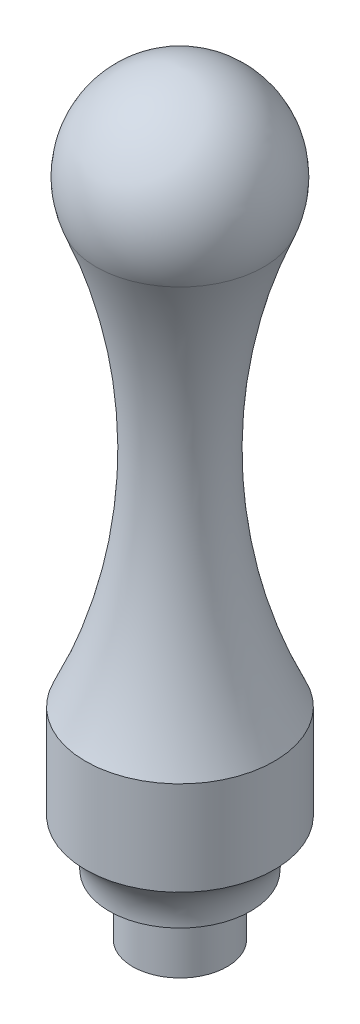
ISO-10303-21;
HEADER;
FILE_DESCRIPTION(('STEP AP214'),'2;1');
FILE_NAME('part.step','',(''),(''),'','','');
FILE_SCHEMA(('AUTOMOTIVE_DESIGN { 1 0 10303 214 1 1 1 1 }'));
ENDSEC;
DATA;
#1=APPLICATION_CONTEXT('core data for automotive mechanical design processes');
#2=APPLICATION_PROTOCOL_DEFINITION('international standard','automotive_design',2000,#1);
#3=PRODUCT_CONTEXT('',#1,'mechanical');
#4=PRODUCT('Part','Part','',(#3));
#5=PRODUCT_RELATED_PRODUCT_CATEGORY('part','',(#4));
#6=PRODUCT_DEFINITION_FORMATION('','',#4);
#7=PRODUCT_DEFINITION_CONTEXT('part definition',#1,'design');
#8=PRODUCT_DEFINITION('design','',#6,#7);
#9=PRODUCT_DEFINITION_SHAPE('','',#8);
#10=(LENGTH_UNIT() NAMED_UNIT(*) SI_UNIT(.MILLI.,.METRE.));
#11=(NAMED_UNIT(*) PLANE_ANGLE_UNIT() SI_UNIT($,.RADIAN.));
#12=(NAMED_UNIT(*) SI_UNIT($,.STERADIAN.) SOLID_ANGLE_UNIT());
#13=UNCERTAINTY_MEASURE_WITH_UNIT(LENGTH_MEASURE(1.E-05),#10,'distance_accuracy_value','');
#14=(GEOMETRIC_REPRESENTATION_CONTEXT(3) GLOBAL_UNCERTAINTY_ASSIGNED_CONTEXT((#13)) GLOBAL_UNIT_ASSIGNED_CONTEXT((#10,
#11,#12)) REPRESENTATION_CONTEXT('',''));
#15=CARTESIAN_POINT('',(0.,0.,0.));
#16=DIRECTION('',(0.,0.,1.));
#17=DIRECTION('',(1.,0.,0.));
#18=AXIS2_PLACEMENT_3D('',#15,#16,#17);
#19=CARTESIAN_POINT('',(0.,70.0058490134191,-0.341973767158095));
#20=DIRECTION('',(-1.,0.,0.));
#21=DIRECTION('',(0.,0.,1.));
#22=AXIS2_PLACEMENT_3D('',#19,#20,#21);
#23=CIRCLE('',#22,9.99999999999999);
#24=TRIMMED_CURVE('',#23,(PARAMETER_VALUE(-1.53659228115495)),
(PARAMETER_VALUE(1.53659228115495)),.T.,.PARAMETER.);
#25=CARTESIAN_POINT('',(0.,70.0058490134191,0.));
#26=DIRECTION('',(0.,1.,0.));
#27=AXIS1_PLACEMENT('',#25,#26);
#28=SURFACE_OF_REVOLUTION('',#24,#27);
#29=CARTESIAN_POINT('',(0.,66.1587953190469,0.));
#30=DIRECTION('',(0.,1.,0.));
#31=DIRECTION('',(0.,0.,1.));
#32=AXIS2_PLACEMENT_3D('',#29,#30,#31);
#33=CIRCLE('',#32,8.88842047537658);
#34=CARTESIAN_POINT('',(0.,66.1587953190469,8.88842047537658));
#35=VERTEX_POINT('',#34);
#36=EDGE_CURVE('E11',#35,#35,#33,.T.);
#37=ORIENTED_EDGE('',*,*,#36,.T.);
#38=EDGE_LOOP('',(#37));
#39=FACE_BOUND('',#38,.T.);
#40=CARTESIAN_POINT('',(0.,80.,0.));
#41=VERTEX_POINT('',#40);
#42=VERTEX_LOOP('',#41);
#43=FACE_BOUND('',#42,.T.);
#44=ADVANCED_FACE('F34',(#39,#43),#28,.T.);
#45=CARTESIAN_POINT('',(0.,45.,0.));
#46=DIRECTION('',(0.,1.,0.));
#47=DIRECTION('',(0.,0.,1.));
#48=AXIS2_PLACEMENT_3D('',#45,#46,#47);
#49=TOROIDAL_SURFACE('',#48,59.6555888093173,55.);
#50=ORIENTED_EDGE('',*,*,#36,.F.);
#51=EDGE_LOOP('',(#50));
#52=FACE_BOUND('',#51,.T.);
#53=CARTESIAN_POINT('',(0.,21.35,0.));
#54=DIRECTION('',(0.,1.,0.));
#55=DIRECTION('',(0.,0.,1.));
#56=AXIS2_PLACEMENT_3D('',#53,#54,#55);
#57=CIRCLE('',#56,10.);
#58=CARTESIAN_POINT('',(0.,21.35,10.));
#59=VERTEX_POINT('',#58);
#60=EDGE_CURVE('E40',#59,#59,#57,.T.);
#61=ORIENTED_EDGE('',*,*,#60,.T.);
#62=EDGE_LOOP('',(#61));
#63=FACE_BOUND('',#62,.T.);
#64=ADVANCED_FACE('F44',(#52,#63),#49,.F.);
#65=CARTESIAN_POINT('',(0.,0.,0.));
#66=DIRECTION('',(0.,1.,0.));
#67=DIRECTION('',(0.,0.,1.));
#68=AXIS2_PLACEMENT_3D('',#65,#66,#67);
#69=CYLINDRICAL_SURFACE('',#68,10.);
#70=ORIENTED_EDGE('',*,*,#60,.F.);
#71=EDGE_LOOP('',(#70));
#72=FACE_BOUND('',#71,.T.);
#73=CARTESIAN_POINT('',(0.,11.399752469181,0.));
#74=DIRECTION('',(0.,1.,0.));
#75=DIRECTION('',(0.,0.,1.));
#76=AXIS2_PLACEMENT_3D('',#73,#74,#75);
#77=CIRCLE('',#76,10.);
#78=CARTESIAN_POINT('',(0.,11.399752469181,10.));
#79=VERTEX_POINT('',#78);
#80=EDGE_CURVE('E56',#79,#79,#77,.T.);
#81=ORIENTED_EDGE('',*,*,#80,.T.);
#82=EDGE_LOOP('',(#81));
#83=FACE_BOUND('',#82,.T.);
#84=ADVANCED_FACE('F49',(#72,#83),#69,.T.);
#85=CARTESIAN_POINT('',(0.,6.35,0.));
#86=DIRECTION('',(0.,1.,0.));
#87=DIRECTION('',(0.,0.,1.));
#88=AXIS2_PLACEMENT_3D('',#85,#86,#87);
#89=TOROIDAL_SURFACE('',#88,13.85,6.35);
#90=ORIENTED_EDGE('',*,*,#80,.F.);
#91=EDGE_LOOP('',(#90));
#92=FACE_BOUND('',#91,.T.);
#93=CARTESIAN_POINT('',(0.,6.34999999999999,0.));
#94=DIRECTION('',(0.,1.,0.));
#95=DIRECTION('',(0.,0.,1.));
#96=AXIS2_PLACEMENT_3D('',#93,#94,#95);
#97=CIRCLE('',#96,7.50000000000001);
#98=CARTESIAN_POINT('',(0.,6.34999999999999,7.50000000000001));
#99=VERTEX_POINT('',#98);
#100=EDGE_CURVE('E58',#99,#99,#97,.T.);
#101=ORIENTED_EDGE('',*,*,#100,.T.);
#102=EDGE_LOOP('',(#101));
#103=FACE_BOUND('',#102,.T.);
#104=ADVANCED_FACE('F84',(#92,#103),#89,.F.);
#105=CARTESIAN_POINT('',(5.,6.35,0.));
#106=DIRECTION('',(0.,1.,0.));
#107=DIRECTION('',(0.,0.,1.));
#108=AXIS2_PLACEMENT_3D('',#105,#106,#107);
#109=PLANE('',#108);
#110=ORIENTED_EDGE('',*,*,#100,.F.);
#111=EDGE_LOOP('',(#110));
#112=FACE_BOUND('',#111,.T.);
#113=CARTESIAN_POINT('',(0.,6.35,0.));
#114=DIRECTION('',(0.,1.,0.));
#115=DIRECTION('',(0.,0.,1.));
#116=AXIS2_PLACEMENT_3D('',#113,#114,#115);
#117=CIRCLE('',#116,5.);
#118=CARTESIAN_POINT('',(0.,6.35,5.));
#119=VERTEX_POINT('',#118);
#120=EDGE_CURVE('E63',#119,#119,#117,.T.);
#121=ORIENTED_EDGE('',*,*,#120,.T.);
#122=EDGE_LOOP('',(#121));
#123=FACE_BOUND('',#122,.T.);
#124=ADVANCED_FACE('F78',(#112,#123),#109,.F.);
#125=CARTESIAN_POINT('',(0.,0.,0.));
#126=DIRECTION('',(0.,1.,0.));
#127=DIRECTION('',(0.,0.,1.));
#128=AXIS2_PLACEMENT_3D('',#125,#126,#127);
#129=CYLINDRICAL_SURFACE('',#128,5.);
#130=ORIENTED_EDGE('',*,*,#120,.F.);
#131=EDGE_LOOP('',(#130));
#132=FACE_BOUND('',#131,.T.);
#133=CARTESIAN_POINT('',(0.,0.,0.));
#134=DIRECTION('',(0.,1.,0.));
#135=DIRECTION('',(0.,0.,1.));
#136=AXIS2_PLACEMENT_3D('',#133,#134,#135);
#137=CIRCLE('',#136,5.);
#138=CARTESIAN_POINT('',(0.,0.,5.));
#139=VERTEX_POINT('',#138);
#140=EDGE_CURVE('E66',#139,#139,#137,.T.);
#141=ORIENTED_EDGE('',*,*,#140,.T.);
#142=EDGE_LOOP('',(#141));
#143=FACE_BOUND('',#142,.T.);
#144=ADVANCED_FACE('F70',(#132,#143),#129,.T.);
#145=CARTESIAN_POINT('',(0.,0.,0.));
#146=DIRECTION('',(0.,1.,0.));
#147=DIRECTION('',(0.,0.,1.));
#148=AXIS2_PLACEMENT_3D('',#145,#146,#147);
#149=PLANE('',#148);
#150=ORIENTED_EDGE('',*,*,#140,.F.);
#151=EDGE_LOOP('',(#150));
#152=FACE_BOUND('',#151,.T.);
#153=ADVANCED_FACE('F72',(#152),#149,.F.);
#154=CLOSED_SHELL('',(#44,#64,#84,#104,#124,#144,#153));
#155=MANIFOLD_SOLID_BREP('B2',#154);
#156=ADVANCED_BREP_SHAPE_REPRESENTATION('',(#18,#155),#14);
#157=SHAPE_DEFINITION_REPRESENTATION(#9,#156);
ENDSEC;
END-ISO-10303-21;
